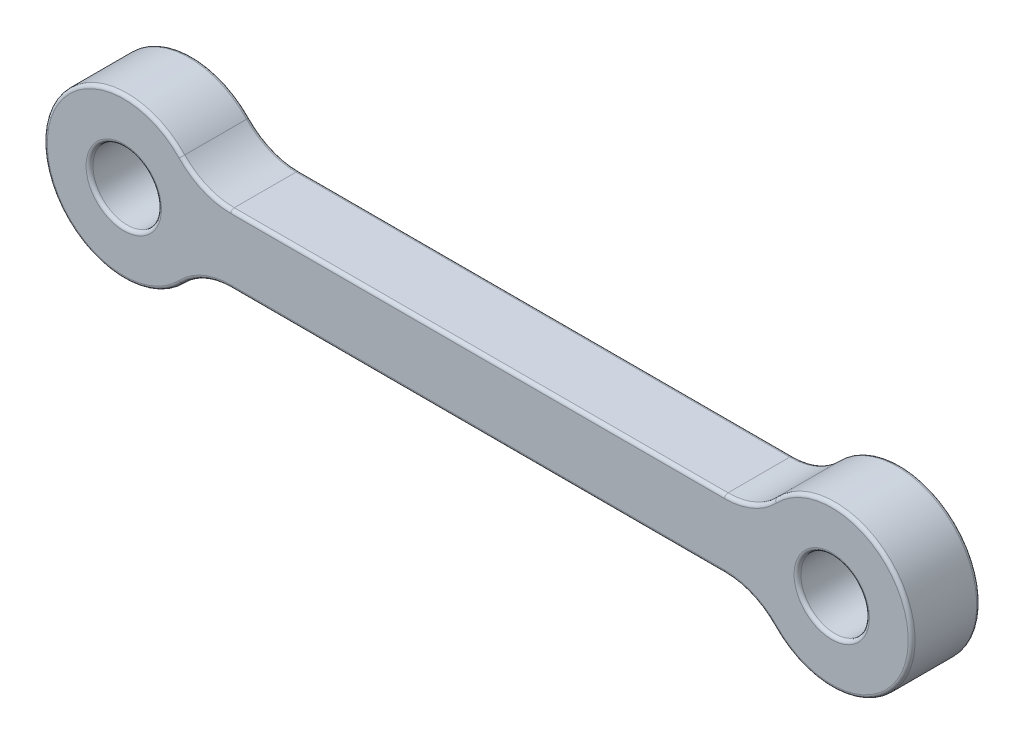
ISO-10303-21;
HEADER;
FILE_DESCRIPTION(('STEP AP214'),'2;1');
FILE_NAME('part.step','',(''),(''),'','','');
FILE_SCHEMA(('AUTOMOTIVE_DESIGN { 1 0 10303 214 1 1 1 1 }'));
ENDSEC;
DATA;
#1=APPLICATION_CONTEXT('core data for automotive mechanical design processes');
#2=APPLICATION_PROTOCOL_DEFINITION('international standard','automotive_design',2000,#1);
#3=PRODUCT_CONTEXT('',#1,'mechanical');
#4=PRODUCT('Part','Part','',(#3));
#5=PRODUCT_RELATED_PRODUCT_CATEGORY('part','',(#4));
#6=PRODUCT_DEFINITION_FORMATION('','',#4);
#7=PRODUCT_DEFINITION_CONTEXT('part definition',#1,'design');
#8=PRODUCT_DEFINITION('design','',#6,#7);
#9=PRODUCT_DEFINITION_SHAPE('','',#8);
#10=(LENGTH_UNIT() NAMED_UNIT(*) SI_UNIT(.MILLI.,.METRE.));
#11=(NAMED_UNIT(*) PLANE_ANGLE_UNIT() SI_UNIT($,.RADIAN.));
#12=(NAMED_UNIT(*) SI_UNIT($,.STERADIAN.) SOLID_ANGLE_UNIT());
#13=UNCERTAINTY_MEASURE_WITH_UNIT(LENGTH_MEASURE(1.E-05),#10,'distance_accuracy_value','');
#14=(GEOMETRIC_REPRESENTATION_CONTEXT(3) GLOBAL_UNCERTAINTY_ASSIGNED_CONTEXT((#13)) GLOBAL_UNIT_ASSIGNED_CONTEXT((#10,
#11,#12)) REPRESENTATION_CONTEXT('',''));
#15=CARTESIAN_POINT('',(0.,0.,0.));
#16=DIRECTION('',(0.,0.,1.));
#17=DIRECTION('',(1.,0.,0.));
#18=AXIS2_PLACEMENT_3D('',#15,#16,#17);
#19=CARTESIAN_POINT('',(0.,0.,3.));
#20=DIRECTION('',(0.,0.,-1.));
#21=DIRECTION('',(-1.,0.,0.));
#22=AXIS2_PLACEMENT_3D('',#19,#20,#21);
#23=CYLINDRICAL_SURFACE('',#22,3.5);
#24=DIRECTION('',(0.,0.,-1.));
#25=VECTOR('',#24,1.);
#26=CARTESIAN_POINT('',(2.52560848605877,2.42307692307692,3.));
#27=LINE('',#26,#25);
#28=CARTESIAN_POINT('',(2.52560848605877,2.42307692307692,2.85));
#29=VERTEX_POINT('',#28);
#30=CARTESIAN_POINT('',(2.52560848605877,2.42307692307692,0.15));
#31=VERTEX_POINT('',#30);
#32=EDGE_CURVE('E366',#29,#31,#27,.T.);
#33=ORIENTED_EDGE('',*,*,#32,.T.);
#34=CARTESIAN_POINT('',(0.,0.,0.15));
#35=DIRECTION('',(0.,0.,1.));
#36=DIRECTION('',(1.,0.,0.));
#37=AXIS2_PLACEMENT_3D('',#34,#35,#36);
#38=CIRCLE('',#37,3.5);
#39=CARTESIAN_POINT('',(2.52560848605877,-2.42307692307692,0.15));
#40=VERTEX_POINT('',#39);
#41=EDGE_CURVE('E249',#31,#40,#38,.T.);
#42=ORIENTED_EDGE('',*,*,#41,.T.);
#43=DIRECTION('',(0.,0.,-1.));
#44=VECTOR('',#43,1.);
#45=CARTESIAN_POINT('',(2.52560848605877,-2.42307692307692,3.));
#46=LINE('',#45,#44);
#47=CARTESIAN_POINT('',(2.52560848605877,-2.42307692307692,2.85));
#48=VERTEX_POINT('',#47);
#49=EDGE_CURVE('E358',#40,#48,#46,.F.);
#50=ORIENTED_EDGE('',*,*,#49,.T.);
#51=CARTESIAN_POINT('',(0.,0.,2.85));
#52=DIRECTION('',(0.,0.,1.));
#53=DIRECTION('',(1.,0.,0.));
#54=AXIS2_PLACEMENT_3D('',#51,#52,#53);
#55=CIRCLE('',#54,3.5);
#56=EDGE_CURVE('E246',#48,#29,#55,.F.);
#57=ORIENTED_EDGE('',*,*,#56,.T.);
#58=EDGE_LOOP('',(#33,#42,#50,#57));
#59=FACE_BOUND('',#58,.T.);
#60=ADVANCED_FACE('F46',(#59),#23,.T.);
#61=CARTESIAN_POINT('',(0.,-1.5,3.));
#62=DIRECTION('',(0.,-1.,0.));
#63=DIRECTION('',(0.,0.,-1.));
#64=AXIS2_PLACEMENT_3D('',#61,#62,#63);
#65=PLANE('',#64);
#66=DIRECTION('',(0.,0.,-1.));
#67=VECTOR('',#66,1.);
#68=CARTESIAN_POINT('',(4.69041575982343,-1.5,3.));
#69=LINE('',#68,#67);
#70=CARTESIAN_POINT('',(4.69041575982343,-1.5,2.85));
#71=VERTEX_POINT('',#70);
#72=CARTESIAN_POINT('',(4.69041575982343,-1.5,0.15));
#73=VERTEX_POINT('',#72);
#74=EDGE_CURVE('E360',#71,#73,#69,.T.);
#75=ORIENTED_EDGE('',*,*,#74,.T.);
#76=DIRECTION('',(-1.,0.,0.));
#77=VECTOR('',#76,1.);
#78=CARTESIAN_POINT('',(26.3095842401766,-1.5,0.15));
#79=LINE('',#78,#77);
#80=CARTESIAN_POINT('',(26.3095842401766,-1.5,0.15));
#81=VERTEX_POINT('',#80);
#82=EDGE_CURVE('E212',#73,#81,#79,.F.);
#83=ORIENTED_EDGE('',*,*,#82,.T.);
#84=DIRECTION('',(0.,0.,1.));
#85=VECTOR('',#84,1.);
#86=CARTESIAN_POINT('',(26.3095842401766,-1.5,3.));
#87=LINE('',#86,#85);
#88=CARTESIAN_POINT('',(26.3095842401766,-1.5,2.85));
#89=VERTEX_POINT('',#88);
#90=EDGE_CURVE('E309',#81,#89,#87,.T.);
#91=ORIENTED_EDGE('',*,*,#90,.T.);
#92=DIRECTION('',(-1.,0.,0.));
#93=VECTOR('',#92,1.);
#94=CARTESIAN_POINT('',(0.,-1.5,2.85));
#95=LINE('',#94,#93);
#96=EDGE_CURVE('E209',#89,#71,#95,.T.);
#97=ORIENTED_EDGE('',*,*,#96,.T.);
#98=EDGE_LOOP('',(#75,#83,#91,#97));
#99=FACE_BOUND('',#98,.T.);
#100=ADVANCED_FACE('F423',(#99),#65,.T.);
#101=CARTESIAN_POINT('',(31.,0.,3.));
#102=DIRECTION('',(0.,0.,-1.));
#103=DIRECTION('',(-1.,0.,0.));
#104=AXIS2_PLACEMENT_3D('',#101,#102,#103);
#105=CYLINDRICAL_SURFACE('',#104,3.5);
#106=DIRECTION('',(0.,0.,-1.));
#107=VECTOR('',#106,1.);
#108=CARTESIAN_POINT('',(28.4743915139412,-2.42307692307692,3.));
#109=LINE('',#108,#107);
#110=CARTESIAN_POINT('',(28.4743915139412,-2.42307692307692,2.85));
#111=VERTEX_POINT('',#110);
#112=CARTESIAN_POINT('',(28.4743915139412,-2.42307692307692,0.15));
#113=VERTEX_POINT('',#112);
#114=EDGE_CURVE('E371',#111,#113,#109,.T.);
#115=ORIENTED_EDGE('',*,*,#114,.T.);
#116=CARTESIAN_POINT('',(31.,0.,0.15));
#117=DIRECTION('',(0.,0.,1.));
#118=DIRECTION('',(1.,0.,0.));
#119=AXIS2_PLACEMENT_3D('',#116,#117,#118);
#120=CIRCLE('',#119,3.5);
#121=CARTESIAN_POINT('',(28.4743915139412,2.42307692307692,0.15));
#122=VERTEX_POINT('',#121);
#123=EDGE_CURVE('E224',#113,#122,#120,.T.);
#124=ORIENTED_EDGE('',*,*,#123,.T.);
#125=DIRECTION('',(0.,0.,-1.));
#126=VECTOR('',#125,1.);
#127=CARTESIAN_POINT('',(28.4743915139412,2.42307692307692,3.));
#128=LINE('',#127,#126);
#129=CARTESIAN_POINT('',(28.4743915139412,2.42307692307692,2.85));
#130=VERTEX_POINT('',#129);
#131=EDGE_CURVE('E365',#122,#130,#128,.F.);
#132=ORIENTED_EDGE('',*,*,#131,.T.);
#133=CARTESIAN_POINT('',(31.,0.,2.85));
#134=DIRECTION('',(0.,0.,1.));
#135=DIRECTION('',(1.,0.,0.));
#136=AXIS2_PLACEMENT_3D('',#133,#134,#135);
#137=CIRCLE('',#136,3.5);
#138=EDGE_CURVE('E221',#130,#111,#137,.F.);
#139=ORIENTED_EDGE('',*,*,#138,.T.);
#140=EDGE_LOOP('',(#115,#124,#132,#139));
#141=FACE_BOUND('',#140,.T.);
#142=ADVANCED_FACE('F472',(#141),#105,.T.);
#143=CARTESIAN_POINT('',(0.,1.5,3.));
#144=DIRECTION('',(0.,-1.,0.));
#145=DIRECTION('',(0.,0.,-1.));
#146=AXIS2_PLACEMENT_3D('',#143,#144,#145);
#147=PLANE('',#146);
#148=DIRECTION('',(0.,0.,-1.));
#149=VECTOR('',#148,1.);
#150=CARTESIAN_POINT('',(26.3095842401766,1.5,3.));
#151=LINE('',#150,#149);
#152=CARTESIAN_POINT('',(26.3095842401766,1.5,2.85));
#153=VERTEX_POINT('',#152);
#154=CARTESIAN_POINT('',(26.3095842401766,1.5,0.15));
#155=VERTEX_POINT('',#154);
#156=EDGE_CURVE('E384',#153,#155,#151,.T.);
#157=ORIENTED_EDGE('',*,*,#156,.T.);
#158=DIRECTION('',(-1.,0.,0.));
#159=VECTOR('',#158,1.);
#160=CARTESIAN_POINT('',(0.,1.5,0.15));
#161=LINE('',#160,#159);
#162=CARTESIAN_POINT('',(4.69041575982343,1.5,0.15));
#163=VERTEX_POINT('',#162);
#164=EDGE_CURVE('E237',#155,#163,#161,.T.);
#165=ORIENTED_EDGE('',*,*,#164,.T.);
#166=DIRECTION('',(0.,0.,1.));
#167=VECTOR('',#166,1.);
#168=CARTESIAN_POINT('',(4.69041575982343,1.5,3.));
#169=LINE('',#168,#167);
#170=CARTESIAN_POINT('',(4.69041575982343,1.5,2.85));
#171=VERTEX_POINT('',#170);
#172=EDGE_CURVE('E380',#163,#171,#169,.T.);
#173=ORIENTED_EDGE('',*,*,#172,.T.);
#174=DIRECTION('',(-1.,0.,0.));
#175=VECTOR('',#174,1.);
#176=CARTESIAN_POINT('',(26.3095842401766,1.5,2.85));
#177=LINE('',#176,#175);
#178=EDGE_CURVE('E234',#171,#153,#177,.F.);
#179=ORIENTED_EDGE('',*,*,#178,.T.);
#180=EDGE_LOOP('',(#157,#165,#173,#179));
#181=FACE_BOUND('',#180,.T.);
#182=ADVANCED_FACE('F456',(#181),#147,.F.);
#183=CARTESIAN_POINT('',(0.,0.,3.));
#184=DIRECTION('',(0.,0.,-1.));
#185=DIRECTION('',(-1.,0.,0.));
#186=AXIS2_PLACEMENT_3D('',#183,#184,#185);
#187=CYLINDRICAL_SURFACE('',#186,1.5);
#188=CARTESIAN_POINT('',(0.,0.,0.15));
#189=DIRECTION('',(0.,0.,1.));
#190=DIRECTION('',(1.,0.,0.));
#191=AXIS2_PLACEMENT_3D('',#188,#189,#190);
#192=CIRCLE('',#191,1.5);
#193=CARTESIAN_POINT('',(1.5,0.,0.15));
#194=VERTEX_POINT('',#193);
#195=EDGE_CURVE('E256',#194,#194,#192,.F.);
#196=ORIENTED_EDGE('',*,*,#195,.T.);
#197=EDGE_LOOP('',(#196));
#198=FACE_BOUND('',#197,.T.);
#199=CARTESIAN_POINT('',(0.,0.,2.85));
#200=DIRECTION('',(0.,0.,1.));
#201=DIRECTION('',(1.,0.,0.));
#202=AXIS2_PLACEMENT_3D('',#199,#200,#201);
#203=CIRCLE('',#202,1.5);
#204=CARTESIAN_POINT('',(1.5,0.,2.85));
#205=VERTEX_POINT('',#204);
#206=EDGE_CURVE('E252',#205,#205,#203,.T.);
#207=ORIENTED_EDGE('',*,*,#206,.T.);
#208=EDGE_LOOP('',(#207));
#209=FACE_BOUND('',#208,.T.);
#210=ADVANCED_FACE('F479',(#198,#209),#187,.F.);
#211=CARTESIAN_POINT('',(31.,0.,3.));
#212=DIRECTION('',(0.,0.,-1.));
#213=DIRECTION('',(-1.,0.,0.));
#214=AXIS2_PLACEMENT_3D('',#211,#212,#213);
#215=CYLINDRICAL_SURFACE('',#214,1.5);
#216=CARTESIAN_POINT('',(31.,0.,0.15));
#217=DIRECTION('',(0.,0.,1.));
#218=DIRECTION('',(1.,0.,0.));
#219=AXIS2_PLACEMENT_3D('',#216,#217,#218);
#220=CIRCLE('',#219,1.5);
#221=CARTESIAN_POINT('',(32.5,0.,0.15));
#222=VERTEX_POINT('',#221);
#223=EDGE_CURVE('E392',#222,#222,#220,.F.);
#224=ORIENTED_EDGE('',*,*,#223,.T.);
#225=EDGE_LOOP('',(#224));
#226=FACE_BOUND('',#225,.T.);
#227=CARTESIAN_POINT('',(31.,0.,2.85));
#228=DIRECTION('',(0.,0.,1.));
#229=DIRECTION('',(1.,0.,0.));
#230=AXIS2_PLACEMENT_3D('',#227,#228,#229);
#231=CIRCLE('',#230,1.5);
#232=CARTESIAN_POINT('',(32.5,0.,2.85));
#233=VERTEX_POINT('',#232);
#234=EDGE_CURVE('E388',#233,#233,#231,.T.);
#235=ORIENTED_EDGE('',*,*,#234,.T.);
#236=EDGE_LOOP('',(#235));
#237=FACE_BOUND('',#236,.T.);
#238=ADVANCED_FACE('F489',(#226,#237),#215,.F.);
#239=CARTESIAN_POINT('',(0.,0.,3.));
#240=DIRECTION('',(0.,0.,1.));
#241=DIRECTION('',(1.,0.,0.));
#242=AXIS2_PLACEMENT_3D('',#239,#240,#241);
#243=PLANE('',#242);
#244=CARTESIAN_POINT('',(31.,0.,3.));
#245=DIRECTION('',(0.,0.,1.));
#246=DIRECTION('',(1.,0.,0.));
#247=AXIS2_PLACEMENT_3D('',#244,#245,#246);
#248=CIRCLE('',#247,1.65);
#249=CARTESIAN_POINT('',(32.65,0.,3.));
#250=VERTEX_POINT('',#249);
#251=EDGE_CURVE('E11',#250,#250,#248,.F.);
#252=ORIENTED_EDGE('',*,*,#251,.T.);
#253=EDGE_LOOP('',(#252));
#254=FACE_BOUND('',#253,.T.);
#255=CARTESIAN_POINT('',(31.,0.,3.));
#256=DIRECTION('',(0.,0.,1.));
#257=DIRECTION('',(1.,0.,0.));
#258=AXIS2_PLACEMENT_3D('',#255,#256,#257);
#259=CIRCLE('',#258,3.35);
#260=CARTESIAN_POINT('',(28.5826318776295,-2.31923076923077,3.));
#261=VERTEX_POINT('',#260);
#262=CARTESIAN_POINT('',(28.5826318776295,2.31923076923077,3.));
#263=VERTEX_POINT('',#262);
#264=EDGE_CURVE('E64',#261,#263,#259,.T.);
#265=ORIENTED_EDGE('',*,*,#264,.T.);
#266=CARTESIAN_POINT('',(26.3095842401766,4.5,3.));
#267=DIRECTION('',(0.,0.,1.));
#268=DIRECTION('',(1.,0.,0.));
#269=AXIS2_PLACEMENT_3D('',#266,#267,#268);
#270=CIRCLE('',#269,3.15);
#271=CARTESIAN_POINT('',(26.3095842401766,1.35,3.));
#272=VERTEX_POINT('',#271);
#273=EDGE_CURVE('E56',#263,#272,#270,.F.);
#274=ORIENTED_EDGE('',*,*,#273,.T.);
#275=DIRECTION('',(-1.,0.,0.));
#276=VECTOR('',#275,1.);
#277=CARTESIAN_POINT('',(4.69041575982343,1.35,3.));
#278=LINE('',#277,#276);
#279=CARTESIAN_POINT('',(4.69041575982343,1.35,3.));
#280=VERTEX_POINT('',#279);
#281=EDGE_CURVE('E264',#272,#280,#278,.T.);
#282=ORIENTED_EDGE('',*,*,#281,.T.);
#283=CARTESIAN_POINT('',(4.69041575982343,4.5,3.));
#284=DIRECTION('',(0.,0.,1.));
#285=DIRECTION('',(1.,0.,0.));
#286=AXIS2_PLACEMENT_3D('',#283,#284,#285);
#287=CIRCLE('',#286,3.15);
#288=CARTESIAN_POINT('',(2.41736812237054,2.31923076923077,3.));
#289=VERTEX_POINT('',#288);
#290=EDGE_CURVE('E267',#280,#289,#287,.F.);
#291=ORIENTED_EDGE('',*,*,#290,.T.);
#292=CARTESIAN_POINT('',(0.,0.,3.));
#293=DIRECTION('',(0.,0.,1.));
#294=DIRECTION('',(1.,0.,0.));
#295=AXIS2_PLACEMENT_3D('',#292,#293,#294);
#296=CIRCLE('',#295,3.35);
#297=CARTESIAN_POINT('',(2.41736812237054,-2.31923076923077,3.));
#298=VERTEX_POINT('',#297);
#299=EDGE_CURVE('E270',#289,#298,#296,.T.);
#300=ORIENTED_EDGE('',*,*,#299,.T.);
#301=CARTESIAN_POINT('',(4.69041575982343,-4.5,3.));
#302=DIRECTION('',(0.,0.,1.));
#303=DIRECTION('',(1.,0.,0.));
#304=AXIS2_PLACEMENT_3D('',#301,#302,#303);
#305=CIRCLE('',#304,3.15);
#306=CARTESIAN_POINT('',(4.69041575982343,-1.35,3.));
#307=VERTEX_POINT('',#306);
#308=EDGE_CURVE('E273',#298,#307,#305,.F.);
#309=ORIENTED_EDGE('',*,*,#308,.T.);
#310=DIRECTION('',(-1.,0.,0.));
#311=VECTOR('',#310,1.);
#312=CARTESIAN_POINT('',(0.,-1.35,3.));
#313=LINE('',#312,#311);
#314=CARTESIAN_POINT('',(26.3095842401766,-1.35,3.));
#315=VERTEX_POINT('',#314);
#316=EDGE_CURVE('E276',#307,#315,#313,.F.);
#317=ORIENTED_EDGE('',*,*,#316,.T.);
#318=CARTESIAN_POINT('',(26.3095842401766,-4.5,3.));
#319=DIRECTION('',(0.,0.,1.));
#320=DIRECTION('',(1.,0.,0.));
#321=AXIS2_PLACEMENT_3D('',#318,#319,#320);
#322=CIRCLE('',#321,3.15);
#323=EDGE_CURVE('E69',#315,#261,#322,.F.);
#324=ORIENTED_EDGE('',*,*,#323,.T.);
#325=EDGE_LOOP('',(#265,#274,#282,#291,#300,#309,#317,#324));
#326=FACE_BOUND('',#325,.T.);
#327=CARTESIAN_POINT('',(0.,0.,3.));
#328=DIRECTION('',(0.,0.,1.));
#329=DIRECTION('',(1.,0.,0.));
#330=AXIS2_PLACEMENT_3D('',#327,#328,#329);
#331=CIRCLE('',#330,1.65);
#332=CARTESIAN_POINT('',(1.65,0.,3.));
#333=VERTEX_POINT('',#332);
#334=EDGE_CURVE('E260',#333,#333,#331,.F.);
#335=ORIENTED_EDGE('',*,*,#334,.T.);
#336=EDGE_LOOP('',(#335));
#337=FACE_BOUND('',#336,.T.);
#338=ADVANCED_FACE('F443',(#254,#326,#337),#243,.T.);
#339=CARTESIAN_POINT('',(0.,0.,0.));
#340=DIRECTION('',(0.,0.,1.));
#341=DIRECTION('',(1.,0.,0.));
#342=AXIS2_PLACEMENT_3D('',#339,#340,#341);
#343=PLANE('',#342);
#344=CARTESIAN_POINT('',(31.,0.,0.));
#345=DIRECTION('',(0.,0.,1.));
#346=DIRECTION('',(1.,0.,0.));
#347=AXIS2_PLACEMENT_3D('',#344,#345,#346);
#348=CIRCLE('',#347,1.65);
#349=CARTESIAN_POINT('',(32.65,0.,0.));
#350=VERTEX_POINT('',#349);
#351=EDGE_CURVE('E192',#350,#350,#348,.T.);
#352=ORIENTED_EDGE('',*,*,#351,.T.);
#353=EDGE_LOOP('',(#352));
#354=FACE_BOUND('',#353,.T.);
#355=DIRECTION('',(-1.,0.,0.));
#356=VECTOR('',#355,1.);
#357=CARTESIAN_POINT('',(4.69041575982343,-1.35,0.));
#358=LINE('',#357,#356);
#359=CARTESIAN_POINT('',(26.3095842401766,-1.35,0.));
#360=VERTEX_POINT('',#359);
#361=CARTESIAN_POINT('',(4.69041575982343,-1.35,0.));
#362=VERTEX_POINT('',#361);
#363=EDGE_CURVE('E189',#360,#362,#358,.T.);
#364=ORIENTED_EDGE('',*,*,#363,.T.);
#365=CARTESIAN_POINT('',(4.69041575982343,-4.5,0.));
#366=DIRECTION('',(0.,0.,1.));
#367=DIRECTION('',(1.,0.,0.));
#368=AXIS2_PLACEMENT_3D('',#365,#366,#367);
#369=CIRCLE('',#368,3.15);
#370=CARTESIAN_POINT('',(2.41736812237054,-2.31923076923077,0.));
#371=VERTEX_POINT('',#370);
#372=EDGE_CURVE('E167',#362,#371,#369,.T.);
#373=ORIENTED_EDGE('',*,*,#372,.T.);
#374=CARTESIAN_POINT('',(0.,0.,0.));
#375=DIRECTION('',(0.,0.,1.));
#376=DIRECTION('',(1.,0.,0.));
#377=AXIS2_PLACEMENT_3D('',#374,#375,#376);
#378=CIRCLE('',#377,3.35);
#379=CARTESIAN_POINT('',(2.41736812237054,2.31923076923077,0.));
#380=VERTEX_POINT('',#379);
#381=EDGE_CURVE('E176',#371,#380,#378,.F.);
#382=ORIENTED_EDGE('',*,*,#381,.T.);
#383=CARTESIAN_POINT('',(4.69041575982343,4.5,0.));
#384=DIRECTION('',(0.,0.,1.));
#385=DIRECTION('',(1.,0.,0.));
#386=AXIS2_PLACEMENT_3D('',#383,#384,#385);
#387=CIRCLE('',#386,3.15);
#388=CARTESIAN_POINT('',(4.69041575982343,1.35,0.));
#389=VERTEX_POINT('',#388);
#390=EDGE_CURVE('E183',#380,#389,#387,.T.);
#391=ORIENTED_EDGE('',*,*,#390,.T.);
#392=DIRECTION('',(-1.,0.,0.));
#393=VECTOR('',#392,1.);
#394=CARTESIAN_POINT('',(0.,1.35,0.));
#395=LINE('',#394,#393);
#396=CARTESIAN_POINT('',(26.3095842401766,1.35,0.));
#397=VERTEX_POINT('',#396);
#398=EDGE_CURVE('E400',#389,#397,#395,.F.);
#399=ORIENTED_EDGE('',*,*,#398,.T.);
#400=CARTESIAN_POINT('',(26.3095842401766,4.5,0.));
#401=DIRECTION('',(0.,0.,1.));
#402=DIRECTION('',(1.,0.,0.));
#403=AXIS2_PLACEMENT_3D('',#400,#401,#402);
#404=CIRCLE('',#403,3.15);
#405=CARTESIAN_POINT('',(28.5826318776295,2.31923076923077,0.));
#406=VERTEX_POINT('',#405);
#407=EDGE_CURVE('E403',#397,#406,#404,.T.);
#408=ORIENTED_EDGE('',*,*,#407,.T.);
#409=CARTESIAN_POINT('',(31.,0.,0.));
#410=DIRECTION('',(0.,0.,1.));
#411=DIRECTION('',(1.,0.,0.));
#412=AXIS2_PLACEMENT_3D('',#409,#410,#411);
#413=CIRCLE('',#412,3.35);
#414=CARTESIAN_POINT('',(28.5826318776295,-2.31923076923077,0.));
#415=VERTEX_POINT('',#414);
#416=EDGE_CURVE('E406',#406,#415,#413,.F.);
#417=ORIENTED_EDGE('',*,*,#416,.T.);
#418=CARTESIAN_POINT('',(26.3095842401766,-4.5,0.));
#419=DIRECTION('',(0.,0.,1.));
#420=DIRECTION('',(1.,0.,0.));
#421=AXIS2_PLACEMENT_3D('',#418,#419,#420);
#422=CIRCLE('',#421,3.15);
#423=EDGE_CURVE('E201',#415,#360,#422,.T.);
#424=ORIENTED_EDGE('',*,*,#423,.T.);
#425=EDGE_LOOP('',(#364,#373,#382,#391,#399,#408,#417,#424));
#426=FACE_BOUND('',#425,.T.);
#427=CARTESIAN_POINT('',(0.,0.,0.));
#428=DIRECTION('',(0.,0.,1.));
#429=DIRECTION('',(1.,0.,0.));
#430=AXIS2_PLACEMENT_3D('',#427,#428,#429);
#431=CIRCLE('',#430,1.65);
#432=CARTESIAN_POINT('',(1.65,0.,0.));
#433=VERTEX_POINT('',#432);
#434=EDGE_CURVE('E184',#433,#433,#431,.T.);
#435=ORIENTED_EDGE('',*,*,#434,.T.);
#436=EDGE_LOOP('',(#435));
#437=FACE_BOUND('',#436,.T.);
#438=ADVANCED_FACE('F186',(#354,#426,#437),#343,.F.);
#439=CARTESIAN_POINT('',(4.69041575982343,-4.5,3.));
#440=DIRECTION('',(0.,0.,-1.));
#441=DIRECTION('',(-1.,0.,0.));
#442=AXIS2_PLACEMENT_3D('',#439,#440,#441);
#443=CYLINDRICAL_SURFACE('',#442,3.);
#444=ORIENTED_EDGE('',*,*,#49,.F.);
#445=CARTESIAN_POINT('',(4.69041575982343,-4.5,0.15));
#446=DIRECTION('',(0.,0.,1.));
#447=DIRECTION('',(1.,0.,0.));
#448=AXIS2_PLACEMENT_3D('',#445,#446,#447);
#449=CIRCLE('',#448,3.);
#450=EDGE_CURVE('E169',#40,#73,#449,.F.);
#451=ORIENTED_EDGE('',*,*,#450,.T.);
#452=ORIENTED_EDGE('',*,*,#74,.F.);
#453=CARTESIAN_POINT('',(4.69041575982343,-4.5,2.85));
#454=DIRECTION('',(0.,0.,1.));
#455=DIRECTION('',(1.,0.,0.));
#456=AXIS2_PLACEMENT_3D('',#453,#454,#455);
#457=CIRCLE('',#456,3.);
#458=EDGE_CURVE('E198',#71,#48,#457,.T.);
#459=ORIENTED_EDGE('',*,*,#458,.T.);
#460=EDGE_LOOP('',(#444,#451,#452,#459));
#461=FACE_BOUND('',#460,.T.);
#462=ADVANCED_FACE('F357',(#461),#443,.F.);
#463=CARTESIAN_POINT('',(26.3095842401766,-4.5,3.));
#464=DIRECTION('',(0.,0.,-1.));
#465=DIRECTION('',(-1.,0.,0.));
#466=AXIS2_PLACEMENT_3D('',#463,#464,#465);
#467=CYLINDRICAL_SURFACE('',#466,3.);
#468=ORIENTED_EDGE('',*,*,#90,.F.);
#469=CARTESIAN_POINT('',(26.3095842401766,-4.5,0.15));
#470=DIRECTION('',(0.,0.,1.));
#471=DIRECTION('',(1.,0.,0.));
#472=AXIS2_PLACEMENT_3D('',#469,#470,#471);
#473=CIRCLE('',#472,3.);
#474=EDGE_CURVE('E218',#81,#113,#473,.F.);
#475=ORIENTED_EDGE('',*,*,#474,.T.);
#476=ORIENTED_EDGE('',*,*,#114,.F.);
#477=CARTESIAN_POINT('',(26.3095842401766,-4.5,2.85));
#478=DIRECTION('',(0.,0.,1.));
#479=DIRECTION('',(1.,0.,0.));
#480=AXIS2_PLACEMENT_3D('',#477,#478,#479);
#481=CIRCLE('',#480,3.);
#482=EDGE_CURVE('E215',#111,#89,#481,.T.);
#483=ORIENTED_EDGE('',*,*,#482,.T.);
#484=EDGE_LOOP('',(#468,#475,#476,#483));
#485=FACE_BOUND('',#484,.T.);
#486=ADVANCED_FACE('F429',(#485),#467,.F.);
#487=CARTESIAN_POINT('',(26.3095842401766,4.5,3.));
#488=DIRECTION('',(0.,0.,-1.));
#489=DIRECTION('',(-1.,0.,0.));
#490=AXIS2_PLACEMENT_3D('',#487,#488,#489);
#491=CYLINDRICAL_SURFACE('',#490,3.);
#492=ORIENTED_EDGE('',*,*,#131,.F.);
#493=CARTESIAN_POINT('',(26.3095842401766,4.5,0.15));
#494=DIRECTION('',(0.,0.,1.));
#495=DIRECTION('',(1.,0.,0.));
#496=AXIS2_PLACEMENT_3D('',#493,#494,#495);
#497=CIRCLE('',#496,3.);
#498=EDGE_CURVE('E231',#122,#155,#497,.F.);
#499=ORIENTED_EDGE('',*,*,#498,.T.);
#500=ORIENTED_EDGE('',*,*,#156,.F.);
#501=CARTESIAN_POINT('',(26.3095842401766,4.5,2.85));
#502=DIRECTION('',(0.,0.,1.));
#503=DIRECTION('',(1.,0.,0.));
#504=AXIS2_PLACEMENT_3D('',#501,#502,#503);
#505=CIRCLE('',#504,3.);
#506=EDGE_CURVE('E227',#153,#130,#505,.T.);
#507=ORIENTED_EDGE('',*,*,#506,.T.);
#508=EDGE_LOOP('',(#492,#499,#500,#507));
#509=FACE_BOUND('',#508,.T.);
#510=ADVANCED_FACE('F461',(#509),#491,.F.);
#511=CARTESIAN_POINT('',(4.69041575982343,4.5,3.));
#512=DIRECTION('',(0.,0.,-1.));
#513=DIRECTION('',(-1.,0.,0.));
#514=AXIS2_PLACEMENT_3D('',#511,#512,#513);
#515=CYLINDRICAL_SURFACE('',#514,3.);
#516=ORIENTED_EDGE('',*,*,#172,.F.);
#517=CARTESIAN_POINT('',(4.69041575982343,4.5,0.15));
#518=DIRECTION('',(0.,0.,1.));
#519=DIRECTION('',(1.,0.,0.));
#520=AXIS2_PLACEMENT_3D('',#517,#518,#519);
#521=CIRCLE('',#520,3.);
#522=EDGE_CURVE('E243',#163,#31,#521,.F.);
#523=ORIENTED_EDGE('',*,*,#522,.T.);
#524=ORIENTED_EDGE('',*,*,#32,.F.);
#525=CARTESIAN_POINT('',(4.69041575982343,4.5,2.85));
#526=DIRECTION('',(0.,0.,1.));
#527=DIRECTION('',(1.,0.,0.));
#528=AXIS2_PLACEMENT_3D('',#525,#526,#527);
#529=CIRCLE('',#528,3.);
#530=EDGE_CURVE('E240',#29,#171,#529,.T.);
#531=ORIENTED_EDGE('',*,*,#530,.T.);
#532=EDGE_LOOP('',(#516,#523,#524,#531));
#533=FACE_BOUND('',#532,.T.);
#534=ADVANCED_FACE('F497',(#533),#515,.F.);
#535=CARTESIAN_POINT('',(31.,0.,0.15));
#536=DIRECTION('',(0.,0.,1.));
#537=DIRECTION('',(1.,0.,0.));
#538=AXIS2_PLACEMENT_3D('',#535,#536,#537);
#539=TOROIDAL_SURFACE('',#538,1.65,0.15);
#540=ORIENTED_EDGE('',*,*,#351,.F.);
#541=EDGE_LOOP('',(#540));
#542=FACE_BOUND('',#541,.T.);
#543=ORIENTED_EDGE('',*,*,#223,.F.);
#544=EDGE_LOOP('',(#543));
#545=FACE_BOUND('',#544,.T.);
#546=ADVANCED_FACE('F500',(#542,#545),#539,.T.);
#547=CARTESIAN_POINT('',(26.3095842401766,4.5,0.15));
#548=DIRECTION('',(0.,0.,1.));
#549=DIRECTION('',(1.,0.,0.));
#550=AXIS2_PLACEMENT_3D('',#547,#548,#549);
#551=TOROIDAL_SURFACE('',#550,3.15,0.15);
#552=CARTESIAN_POINT('',(26.3095842401766,1.35,0.15));
#553=DIRECTION('',(-1.,0.,0.));
#554=DIRECTION('',(0.,0.,1.));
#555=AXIS2_PLACEMENT_3D('',#552,#553,#554);
#556=CIRCLE('',#555,0.15);
#557=EDGE_CURVE('E301',#155,#397,#556,.T.);
#558=ORIENTED_EDGE('',*,*,#557,.F.);
#559=ORIENTED_EDGE('',*,*,#498,.F.);
#560=CARTESIAN_POINT('',(28.5826318776295,2.31923076923077,0.15));
#561=DIRECTION('',(0.692307692307703,0.72160242458821,0.));
#562=DIRECTION('',(-0.72160242458821,0.692307692307703,0.));
#563=AXIS2_PLACEMENT_3D('',#560,#561,#562);
#564=CIRCLE('',#563,0.15);
#565=EDGE_CURVE('E305',#406,#122,#564,.T.);
#566=ORIENTED_EDGE('',*,*,#565,.F.);
#567=ORIENTED_EDGE('',*,*,#407,.F.);
#568=EDGE_LOOP('',(#558,#559,#566,#567));
#569=FACE_BOUND('',#568,.T.);
#570=ADVANCED_FACE('F465',(#569),#551,.T.);
#571=CARTESIAN_POINT('',(31.,0.,0.15));
#572=DIRECTION('',(0.,0.,1.));
#573=DIRECTION('',(1.,0.,0.));
#574=AXIS2_PLACEMENT_3D('',#571,#572,#573);
#575=TOROIDAL_SURFACE('',#574,3.35,0.15);
#576=ORIENTED_EDGE('',*,*,#565,.T.);
#577=ORIENTED_EDGE('',*,*,#123,.F.);
#578=CARTESIAN_POINT('',(28.5826318776295,-2.31923076923077,0.15));
#579=DIRECTION('',(-0.692307692307698,0.721602424588214,0.));
#580=DIRECTION('',(-0.721602424588214,-0.692307692307698,0.));
#581=AXIS2_PLACEMENT_3D('',#578,#579,#580);
#582=CIRCLE('',#581,0.15);
#583=EDGE_CURVE('E297',#415,#113,#582,.T.);
#584=ORIENTED_EDGE('',*,*,#583,.F.);
#585=ORIENTED_EDGE('',*,*,#416,.F.);
#586=EDGE_LOOP('',(#576,#577,#584,#585));
#587=FACE_BOUND('',#586,.T.);
#588=ADVANCED_FACE('F470',(#587),#575,.T.);
#589=CARTESIAN_POINT('',(0.,1.35,0.15));
#590=DIRECTION('',(-1.,0.,0.));
#591=DIRECTION('',(0.,0.,1.));
#592=AXIS2_PLACEMENT_3D('',#589,#590,#591);
#593=CYLINDRICAL_SURFACE('',#592,0.15);
#594=ORIENTED_EDGE('',*,*,#557,.T.);
#595=ORIENTED_EDGE('',*,*,#398,.F.);
#596=CARTESIAN_POINT('',(4.69041575982343,1.35,0.15));
#597=DIRECTION('',(-1.,0.,0.));
#598=DIRECTION('',(0.,0.,1.));
#599=AXIS2_PLACEMENT_3D('',#596,#597,#598);
#600=CIRCLE('',#599,0.15);
#601=EDGE_CURVE('E293',#163,#389,#600,.T.);
#602=ORIENTED_EDGE('',*,*,#601,.F.);
#603=ORIENTED_EDGE('',*,*,#164,.F.);
#604=EDGE_LOOP('',(#594,#595,#602,#603));
#605=FACE_BOUND('',#604,.T.);
#606=ADVANCED_FACE('F518',(#605),#593,.T.);
#607=CARTESIAN_POINT('',(26.3095842401766,-4.5,0.15));
#608=DIRECTION('',(0.,0.,1.));
#609=DIRECTION('',(1.,0.,0.));
#610=AXIS2_PLACEMENT_3D('',#607,#608,#609);
#611=TOROIDAL_SURFACE('',#610,3.15,0.15);
#612=ORIENTED_EDGE('',*,*,#583,.T.);
#613=ORIENTED_EDGE('',*,*,#474,.F.);
#614=CARTESIAN_POINT('',(26.3095842401766,-1.35,0.15));
#615=DIRECTION('',(-1.,0.,0.));
#616=DIRECTION('',(0.,0.,1.));
#617=AXIS2_PLACEMENT_3D('',#614,#615,#616);
#618=CIRCLE('',#617,0.15);
#619=EDGE_CURVE('E289',#360,#81,#618,.T.);
#620=ORIENTED_EDGE('',*,*,#619,.F.);
#621=ORIENTED_EDGE('',*,*,#423,.F.);
#622=EDGE_LOOP('',(#612,#613,#620,#621));
#623=FACE_BOUND('',#622,.T.);
#624=ADVANCED_FACE('F416',(#623),#611,.T.);
#625=CARTESIAN_POINT('',(4.69041575982343,4.5,0.15));
#626=DIRECTION('',(0.,0.,1.));
#627=DIRECTION('',(1.,0.,0.));
#628=AXIS2_PLACEMENT_3D('',#625,#626,#627);
#629=TOROIDAL_SURFACE('',#628,3.15,0.15);
#630=ORIENTED_EDGE('',*,*,#601,.T.);
#631=ORIENTED_EDGE('',*,*,#390,.F.);
#632=CARTESIAN_POINT('',(2.41736812237054,2.31923076923077,0.15));
#633=DIRECTION('',(-0.692307692307693,0.72160242458822,0.));
#634=DIRECTION('',(-0.72160242458822,-0.692307692307693,0.));
#635=AXIS2_PLACEMENT_3D('',#632,#633,#634);
#636=CIRCLE('',#635,0.15);
#637=EDGE_CURVE('E179',#31,#380,#636,.T.);
#638=ORIENTED_EDGE('',*,*,#637,.F.);
#639=ORIENTED_EDGE('',*,*,#522,.F.);
#640=EDGE_LOOP('',(#630,#631,#638,#639));
#641=FACE_BOUND('',#640,.T.);
#642=ADVANCED_FACE('F512',(#641),#629,.T.);
#643=CARTESIAN_POINT('',(0.,-1.35,0.15));
#644=DIRECTION('',(1.,0.,0.));
#645=DIRECTION('',(0.,0.,-1.));
#646=AXIS2_PLACEMENT_3D('',#643,#644,#645);
#647=CYLINDRICAL_SURFACE('',#646,0.15);
#648=ORIENTED_EDGE('',*,*,#619,.T.);
#649=ORIENTED_EDGE('',*,*,#82,.F.);
#650=CARTESIAN_POINT('',(4.69041575982343,-1.35,0.15));
#651=DIRECTION('',(-1.,0.,0.));
#652=DIRECTION('',(0.,0.,1.));
#653=AXIS2_PLACEMENT_3D('',#650,#651,#652);
#654=CIRCLE('',#653,0.15);
#655=EDGE_CURVE('E173',#362,#73,#654,.T.);
#656=ORIENTED_EDGE('',*,*,#655,.F.);
#657=ORIENTED_EDGE('',*,*,#363,.F.);
#658=EDGE_LOOP('',(#648,#649,#656,#657));
#659=FACE_BOUND('',#658,.T.);
#660=ADVANCED_FACE('F419',(#659),#647,.T.);
#661=CARTESIAN_POINT('',(0.,0.,0.15));
#662=DIRECTION('',(0.,0.,1.));
#663=DIRECTION('',(1.,0.,0.));
#664=AXIS2_PLACEMENT_3D('',#661,#662,#663);
#665=TOROIDAL_SURFACE('',#664,3.35,0.15);
#666=ORIENTED_EDGE('',*,*,#637,.T.);
#667=ORIENTED_EDGE('',*,*,#381,.F.);
#668=CARTESIAN_POINT('',(2.41736812237054,-2.31923076923077,0.15));
#669=DIRECTION('',(0.692307692307693,0.72160242458822,0.));
#670=DIRECTION('',(-0.72160242458822,0.692307692307693,0.));
#671=AXIS2_PLACEMENT_3D('',#668,#669,#670);
#672=CIRCLE('',#671,0.15);
#673=EDGE_CURVE('E163',#40,#371,#672,.T.);
#674=ORIENTED_EDGE('',*,*,#673,.F.);
#675=ORIENTED_EDGE('',*,*,#41,.F.);
#676=EDGE_LOOP('',(#666,#667,#674,#675));
#677=FACE_BOUND('',#676,.T.);
#678=ADVANCED_FACE('F177',(#677),#665,.T.);
#679=CARTESIAN_POINT('',(4.69041575982343,-4.5,0.15));
#680=DIRECTION('',(0.,0.,1.));
#681=DIRECTION('',(1.,0.,0.));
#682=AXIS2_PLACEMENT_3D('',#679,#680,#681);
#683=TOROIDAL_SURFACE('',#682,3.15,0.15);
#684=ORIENTED_EDGE('',*,*,#655,.T.);
#685=ORIENTED_EDGE('',*,*,#450,.F.);
#686=ORIENTED_EDGE('',*,*,#673,.T.);
#687=ORIENTED_EDGE('',*,*,#372,.F.);
#688=EDGE_LOOP('',(#684,#685,#686,#687));
#689=FACE_BOUND('',#688,.T.);
#690=ADVANCED_FACE('F165',(#689),#683,.T.);
#691=CARTESIAN_POINT('',(0.,0.,0.15));
#692=DIRECTION('',(0.,0.,1.));
#693=DIRECTION('',(1.,0.,0.));
#694=AXIS2_PLACEMENT_3D('',#691,#692,#693);
#695=TOROIDAL_SURFACE('',#694,1.65,0.15);
#696=ORIENTED_EDGE('',*,*,#195,.F.);
#697=EDGE_LOOP('',(#696));
#698=FACE_BOUND('',#697,.T.);
#699=ORIENTED_EDGE('',*,*,#434,.F.);
#700=EDGE_LOOP('',(#699));
#701=FACE_BOUND('',#700,.T.);
#702=ADVANCED_FACE('F507',(#698,#701),#695,.T.);
#703=CARTESIAN_POINT('',(31.,0.,2.85));
#704=DIRECTION('',(0.,0.,1.));
#705=DIRECTION('',(1.,0.,0.));
#706=AXIS2_PLACEMENT_3D('',#703,#704,#705);
#707=TOROIDAL_SURFACE('',#706,1.65,0.15);
#708=ORIENTED_EDGE('',*,*,#234,.F.);
#709=EDGE_LOOP('',(#708));
#710=FACE_BOUND('',#709,.T.);
#711=ORIENTED_EDGE('',*,*,#251,.F.);
#712=EDGE_LOOP('',(#711));
#713=FACE_BOUND('',#712,.T.);
#714=ADVANCED_FACE('F528',(#710,#713),#707,.T.);
#715=CARTESIAN_POINT('',(4.69041575982343,-4.5,2.85));
#716=DIRECTION('',(0.,0.,1.));
#717=DIRECTION('',(1.,0.,0.));
#718=AXIS2_PLACEMENT_3D('',#715,#716,#717);
#719=TOROIDAL_SURFACE('',#718,3.15,0.15);
#720=CARTESIAN_POINT('',(2.41736812237054,-2.31923076923077,2.85));
#721=DIRECTION('',(-0.692307692307693,-0.72160242458822,0.));
#722=DIRECTION('',(0.72160242458822,-0.692307692307693,0.));
#723=AXIS2_PLACEMENT_3D('',#720,#721,#722);
#724=CIRCLE('',#723,0.15);
#725=EDGE_CURVE('E331',#48,#298,#724,.T.);
#726=ORIENTED_EDGE('',*,*,#725,.F.);
#727=ORIENTED_EDGE('',*,*,#458,.F.);
#728=CARTESIAN_POINT('',(4.69041575982343,-1.35,2.85));
#729=DIRECTION('',(1.,0.,0.));
#730=DIRECTION('',(0.,0.,-1.));
#731=AXIS2_PLACEMENT_3D('',#728,#729,#730);
#732=CIRCLE('',#731,0.15);
#733=EDGE_CURVE('E50',#307,#71,#732,.T.);
#734=ORIENTED_EDGE('',*,*,#733,.F.);
#735=ORIENTED_EDGE('',*,*,#308,.F.);
#736=EDGE_LOOP('',(#726,#727,#734,#735));
#737=FACE_BOUND('',#736,.T.);
#738=ADVANCED_FACE('F352',(#737),#719,.T.);
#739=CARTESIAN_POINT('',(0.,-1.35,2.85));
#740=DIRECTION('',(-1.,0.,0.));
#741=DIRECTION('',(0.,0.,1.));
#742=AXIS2_PLACEMENT_3D('',#739,#740,#741);
#743=CYLINDRICAL_SURFACE('',#742,0.15);
#744=ORIENTED_EDGE('',*,*,#733,.T.);
#745=ORIENTED_EDGE('',*,*,#96,.F.);
#746=CARTESIAN_POINT('',(26.3095842401766,-1.35,2.85));
#747=DIRECTION('',(1.,0.,0.));
#748=DIRECTION('',(0.,0.,-1.));
#749=AXIS2_PLACEMENT_3D('',#746,#747,#748);
#750=CIRCLE('',#749,0.15);
#751=EDGE_CURVE('E328',#315,#89,#750,.T.);
#752=ORIENTED_EDGE('',*,*,#751,.F.);
#753=ORIENTED_EDGE('',*,*,#316,.F.);
#754=EDGE_LOOP('',(#744,#745,#752,#753));
#755=FACE_BOUND('',#754,.T.);
#756=ADVANCED_FACE('F347',(#755),#743,.T.);
#757=CARTESIAN_POINT('',(0.,0.,2.85));
#758=DIRECTION('',(0.,0.,1.));
#759=DIRECTION('',(1.,0.,0.));
#760=AXIS2_PLACEMENT_3D('',#757,#758,#759);
#761=TOROIDAL_SURFACE('',#760,3.35,0.15);
#762=ORIENTED_EDGE('',*,*,#725,.T.);
#763=ORIENTED_EDGE('',*,*,#299,.F.);
#764=CARTESIAN_POINT('',(2.41736812237054,2.31923076923077,2.85));
#765=DIRECTION('',(0.692307692307693,-0.72160242458822,0.));
#766=DIRECTION('',(0.72160242458822,0.692307692307693,0.));
#767=AXIS2_PLACEMENT_3D('',#764,#765,#766);
#768=CIRCLE('',#767,0.15);
#769=EDGE_CURVE('E324',#29,#289,#768,.T.);
#770=ORIENTED_EDGE('',*,*,#769,.F.);
#771=ORIENTED_EDGE('',*,*,#56,.F.);
#772=EDGE_LOOP('',(#762,#763,#770,#771));
#773=FACE_BOUND('',#772,.T.);
#774=ADVANCED_FACE('F543',(#773),#761,.T.);
#775=CARTESIAN_POINT('',(26.3095842401766,-4.5,2.85));
#776=DIRECTION('',(0.,0.,1.));
#777=DIRECTION('',(1.,0.,0.));
#778=AXIS2_PLACEMENT_3D('',#775,#776,#777);
#779=TOROIDAL_SURFACE('',#778,3.15,0.15);
#780=ORIENTED_EDGE('',*,*,#751,.T.);
#781=ORIENTED_EDGE('',*,*,#482,.F.);
#782=CARTESIAN_POINT('',(28.5826318776295,-2.31923076923077,2.85));
#783=DIRECTION('',(0.692307692307703,-0.72160242458821,0.));
#784=DIRECTION('',(0.72160242458821,0.692307692307703,0.));
#785=AXIS2_PLACEMENT_3D('',#782,#783,#784);
#786=CIRCLE('',#785,0.15);
#787=EDGE_CURVE('E320',#261,#111,#786,.T.);
#788=ORIENTED_EDGE('',*,*,#787,.F.);
#789=ORIENTED_EDGE('',*,*,#323,.F.);
#790=EDGE_LOOP('',(#780,#781,#788,#789));
#791=FACE_BOUND('',#790,.T.);
#792=ADVANCED_FACE('F433',(#791),#779,.T.);
#793=CARTESIAN_POINT('',(4.69041575982343,4.5,2.85));
#794=DIRECTION('',(0.,0.,1.));
#795=DIRECTION('',(1.,0.,0.));
#796=AXIS2_PLACEMENT_3D('',#793,#794,#795);
#797=TOROIDAL_SURFACE('',#796,3.15,0.15);
#798=ORIENTED_EDGE('',*,*,#769,.T.);
#799=ORIENTED_EDGE('',*,*,#290,.F.);
#800=CARTESIAN_POINT('',(4.69041575982343,1.35,2.85));
#801=DIRECTION('',(1.,0.,0.));
#802=DIRECTION('',(0.,0.,-1.));
#803=AXIS2_PLACEMENT_3D('',#800,#801,#802);
#804=CIRCLE('',#803,0.15);
#805=EDGE_CURVE('E316',#171,#280,#804,.T.);
#806=ORIENTED_EDGE('',*,*,#805,.F.);
#807=ORIENTED_EDGE('',*,*,#530,.F.);
#808=EDGE_LOOP('',(#798,#799,#806,#807));
#809=FACE_BOUND('',#808,.T.);
#810=ADVANCED_FACE('F449',(#809),#797,.T.);
#811=CARTESIAN_POINT('',(31.,0.,2.85));
#812=DIRECTION('',(0.,0.,1.));
#813=DIRECTION('',(1.,0.,0.));
#814=AXIS2_PLACEMENT_3D('',#811,#812,#813);
#815=TOROIDAL_SURFACE('',#814,3.35,0.15);
#816=ORIENTED_EDGE('',*,*,#787,.T.);
#817=ORIENTED_EDGE('',*,*,#138,.F.);
#818=CARTESIAN_POINT('',(28.5826318776295,2.31923076923077,2.85));
#819=DIRECTION('',(-0.692307692307698,-0.721602424588214,0.));
#820=DIRECTION('',(0.721602424588214,-0.692307692307698,0.));
#821=AXIS2_PLACEMENT_3D('',#818,#819,#820);
#822=CIRCLE('',#821,0.15);
#823=EDGE_CURVE('E313',#263,#130,#822,.T.);
#824=ORIENTED_EDGE('',*,*,#823,.F.);
#825=ORIENTED_EDGE('',*,*,#264,.F.);
#826=EDGE_LOOP('',(#816,#817,#824,#825));
#827=FACE_BOUND('',#826,.T.);
#828=ADVANCED_FACE('F436',(#827),#815,.T.);
#829=CARTESIAN_POINT('',(0.,1.35,2.85));
#830=DIRECTION('',(1.,0.,0.));
#831=DIRECTION('',(0.,0.,-1.));
#832=AXIS2_PLACEMENT_3D('',#829,#830,#831);
#833=CYLINDRICAL_SURFACE('',#832,0.15);
#834=ORIENTED_EDGE('',*,*,#805,.T.);
#835=ORIENTED_EDGE('',*,*,#281,.F.);
#836=CARTESIAN_POINT('',(26.3095842401766,1.35,2.85));
#837=DIRECTION('',(1.,0.,0.));
#838=DIRECTION('',(0.,0.,-1.));
#839=AXIS2_PLACEMENT_3D('',#836,#837,#838);
#840=CIRCLE('',#839,0.15);
#841=EDGE_CURVE('E310',#153,#272,#840,.T.);
#842=ORIENTED_EDGE('',*,*,#841,.F.);
#843=ORIENTED_EDGE('',*,*,#178,.F.);
#844=EDGE_LOOP('',(#834,#835,#842,#843));
#845=FACE_BOUND('',#844,.T.);
#846=ADVANCED_FACE('F453',(#845),#833,.T.);
#847=CARTESIAN_POINT('',(26.3095842401766,4.5,2.85));
#848=DIRECTION('',(0.,0.,1.));
#849=DIRECTION('',(1.,0.,0.));
#850=AXIS2_PLACEMENT_3D('',#847,#848,#849);
#851=TOROIDAL_SURFACE('',#850,3.15,0.15);
#852=ORIENTED_EDGE('',*,*,#823,.T.);
#853=ORIENTED_EDGE('',*,*,#506,.F.);
#854=ORIENTED_EDGE('',*,*,#841,.T.);
#855=ORIENTED_EDGE('',*,*,#273,.F.);
#856=EDGE_LOOP('',(#852,#853,#854,#855));
#857=FACE_BOUND('',#856,.T.);
#858=ADVANCED_FACE('F440',(#857),#851,.T.);
#859=CARTESIAN_POINT('',(0.,0.,2.85));
#860=DIRECTION('',(0.,0.,1.));
#861=DIRECTION('',(1.,0.,0.));
#862=AXIS2_PLACEMENT_3D('',#859,#860,#861);
#863=TOROIDAL_SURFACE('',#862,1.65,0.15);
#864=ORIENTED_EDGE('',*,*,#334,.F.);
#865=EDGE_LOOP('',(#864));
#866=FACE_BOUND('',#865,.T.);
#867=ORIENTED_EDGE('',*,*,#206,.F.);
#868=EDGE_LOOP('',(#867));
#869=FACE_BOUND('',#868,.T.);
#870=ADVANCED_FACE('F48',(#866,#869),#863,.T.);
#871=CLOSED_SHELL('',(#60,#100,#142,#182,#210,#238,#338,#438,#462,#486,#510,#534,#546,#570,#588,
#606,#624,#642,#660,#678,#690,#702,#714,#738,#756,#774,#792,#810,#828,#846,#858,#870));
#872=MANIFOLD_SOLID_BREP('B2',#871);
#873=ADVANCED_BREP_SHAPE_REPRESENTATION('',(#18,#872),#14);
#874=SHAPE_DEFINITION_REPRESENTATION(#9,#873);
ENDSEC;
END-ISO-10303-21;
